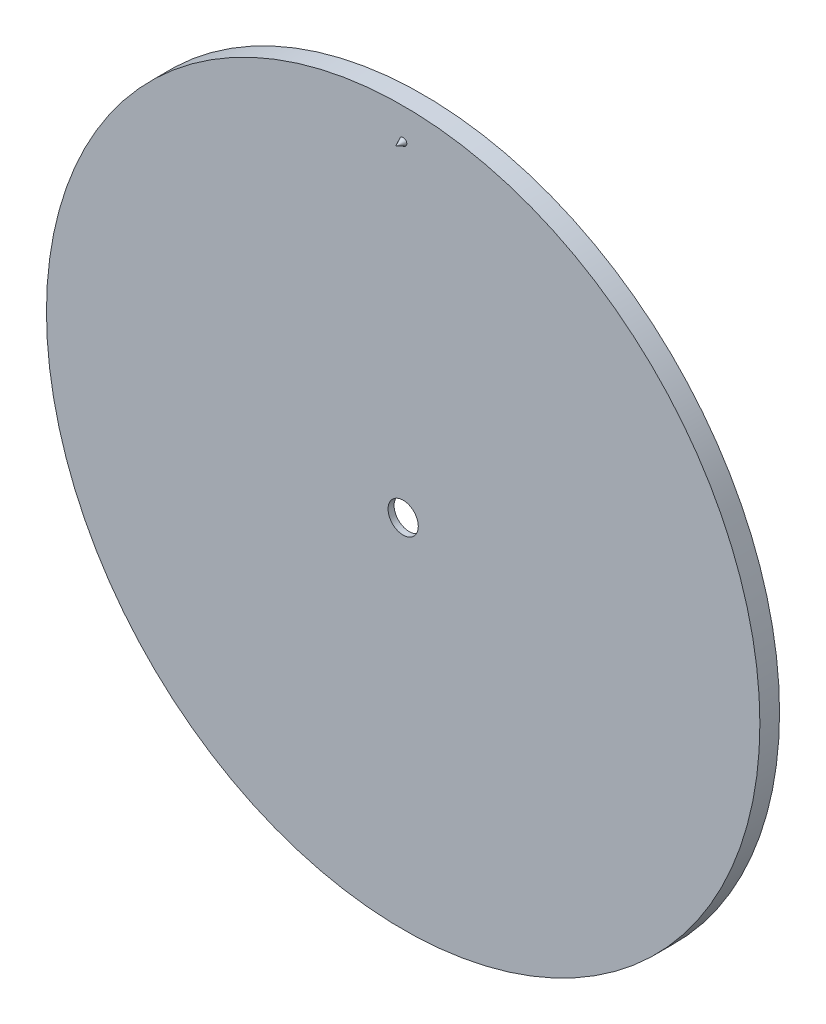
ISO-10303-21;
HEADER;
FILE_DESCRIPTION(('STEP AP214'),'2;1');
FILE_NAME('part.step','',(''),(''),'','','');
FILE_SCHEMA(('AUTOMOTIVE_DESIGN { 1 0 10303 214 1 1 1 1 }'));
ENDSEC;
DATA;
#1=APPLICATION_CONTEXT('core data for automotive mechanical design processes');
#2=APPLICATION_PROTOCOL_DEFINITION('international standard','automotive_design',2000,#1);
#3=PRODUCT_CONTEXT('',#1,'mechanical');
#4=PRODUCT('Part','Part','',(#3));
#5=PRODUCT_RELATED_PRODUCT_CATEGORY('part','',(#4));
#6=PRODUCT_DEFINITION_FORMATION('','',#4);
#7=PRODUCT_DEFINITION_CONTEXT('part definition',#1,'design');
#8=PRODUCT_DEFINITION('design','',#6,#7);
#9=PRODUCT_DEFINITION_SHAPE('','',#8);
#10=(LENGTH_UNIT() NAMED_UNIT(*) SI_UNIT(.MILLI.,.METRE.));
#11=(NAMED_UNIT(*) PLANE_ANGLE_UNIT() SI_UNIT($,.RADIAN.));
#12=(NAMED_UNIT(*) SI_UNIT($,.STERADIAN.) SOLID_ANGLE_UNIT());
#13=UNCERTAINTY_MEASURE_WITH_UNIT(LENGTH_MEASURE(1.E-05),#10,'distance_accuracy_value','');
#14=(GEOMETRIC_REPRESENTATION_CONTEXT(3) GLOBAL_UNCERTAINTY_ASSIGNED_CONTEXT((#13)) GLOBAL_UNIT_ASSIGNED_CONTEXT((#10,
#11,#12)) REPRESENTATION_CONTEXT('',''));
#15=CARTESIAN_POINT('',(0.,0.,0.));
#16=DIRECTION('',(0.,0.,1.));
#17=DIRECTION('',(1.,0.,0.));
#18=AXIS2_PLACEMENT_3D('',#15,#16,#17);
#19=CARTESIAN_POINT('',(0.,0.,4.1275));
#20=DIRECTION('',(0.,0.,-1.));
#21=DIRECTION('',(-1.,0.,0.));
#22=AXIS2_PLACEMENT_3D('',#19,#20,#21);
#23=CYLINDRICAL_SURFACE('',#22,3.175);
#24=CARTESIAN_POINT('',(0.,0.,4.1275));
#25=DIRECTION('',(0.,0.,1.));
#26=DIRECTION('',(1.,0.,0.));
#27=AXIS2_PLACEMENT_3D('',#24,#25,#26);
#28=CIRCLE('',#27,3.175);
#29=CARTESIAN_POINT('',(3.175,0.,4.1275));
#30=VERTEX_POINT('',#29);
#31=EDGE_CURVE('E66',#30,#30,#28,.T.);
#32=ORIENTED_EDGE('',*,*,#31,.T.);
#33=EDGE_LOOP('',(#32));
#34=FACE_BOUND('',#33,.T.);
#35=CARTESIAN_POINT('',(0.,0.,2.8575));
#36=DIRECTION('',(0.,0.,-1.));
#37=DIRECTION('',(-1.,0.,0.));
#38=AXIS2_PLACEMENT_3D('',#35,#36,#37);
#39=CIRCLE('',#38,3.175);
#40=CARTESIAN_POINT('',(-3.175,0.,2.8575));
#41=VERTEX_POINT('',#40);
#42=EDGE_CURVE('E41',#41,#41,#39,.T.);
#43=ORIENTED_EDGE('',*,*,#42,.T.);
#44=EDGE_LOOP('',(#43));
#45=FACE_BOUND('',#44,.T.);
#46=ADVANCED_FACE('F37',(#34,#45),#23,.F.);
#47=CARTESIAN_POINT('',(0.,0.,4.1275));
#48=DIRECTION('',(0.,0.,1.));
#49=DIRECTION('',(1.,0.,0.));
#50=AXIS2_PLACEMENT_3D('',#47,#48,#49);
#51=PLANE('',#50);
#52=CARTESIAN_POINT('',(0.,68.4003748190169,4.1275));
#53=DIRECTION('',(0.,0.,1.));
#54=DIRECTION('',(1.,0.,0.));
#55=AXIS2_PLACEMENT_3D('',#52,#53,#54);
#56=CIRCLE('',#55,0.761999999999999);
#57=CARTESIAN_POINT('',(0.761999999999999,68.4003748190169,4.1275));
#58=VERTEX_POINT('',#57);
#59=EDGE_CURVE('E56',#58,#58,#56,.T.);
#60=ORIENTED_EDGE('',*,*,#59,.F.);
#61=EDGE_LOOP('',(#60));
#62=FACE_BOUND('',#61,.T.);
#63=CARTESIAN_POINT('',(0.,0.,4.1275));
#64=DIRECTION('',(0.,0.,1.));
#65=DIRECTION('',(1.,0.,0.));
#66=AXIS2_PLACEMENT_3D('',#63,#64,#65);
#67=CIRCLE('',#66,74.93);
#68=CARTESIAN_POINT('',(74.93,0.,4.1275));
#69=VERTEX_POINT('',#68);
#70=EDGE_CURVE('E11',#69,#69,#67,.T.);
#71=ORIENTED_EDGE('',*,*,#70,.T.);
#72=EDGE_LOOP('',(#71));
#73=FACE_BOUND('',#72,.T.);
#74=ORIENTED_EDGE('',*,*,#31,.F.);
#75=EDGE_LOOP('',(#74));
#76=FACE_BOUND('',#75,.T.);
#77=ADVANCED_FACE('F74',(#62,#73,#76),#51,.T.);
#78=CARTESIAN_POINT('',(0.,0.,0.));
#79=DIRECTION('',(0.,0.,1.));
#80=DIRECTION('',(1.,0.,0.));
#81=AXIS2_PLACEMENT_3D('',#78,#79,#80);
#82=PLANE('',#81);
#83=CARTESIAN_POINT('',(0.,0.,0.));
#84=DIRECTION('',(0.,0.,-1.));
#85=DIRECTION('',(-1.,0.,0.));
#86=AXIS2_PLACEMENT_3D('',#83,#84,#85);
#87=CIRCLE('',#86,73.66);
#88=CARTESIAN_POINT('',(-73.66,0.,0.));
#89=VERTEX_POINT('',#88);
#90=EDGE_CURVE('E58',#89,#89,#87,.T.);
#91=ORIENTED_EDGE('',*,*,#90,.F.);
#92=EDGE_LOOP('',(#91));
#93=FACE_BOUND('',#92,.T.);
#94=CARTESIAN_POINT('',(0.,0.,0.));
#95=DIRECTION('',(0.,0.,1.));
#96=DIRECTION('',(1.,0.,0.));
#97=AXIS2_PLACEMENT_3D('',#94,#95,#96);
#98=CIRCLE('',#97,74.93);
#99=CARTESIAN_POINT('',(74.93,0.,0.));
#100=VERTEX_POINT('',#99);
#101=EDGE_CURVE('E45',#100,#100,#98,.T.);
#102=ORIENTED_EDGE('',*,*,#101,.F.);
#103=EDGE_LOOP('',(#102));
#104=FACE_BOUND('',#103,.T.);
#105=ADVANCED_FACE('F72',(#93,#104),#82,.F.);
#106=CARTESIAN_POINT('',(0.,0.,4.1275));
#107=DIRECTION('',(0.,0.,-1.));
#108=DIRECTION('',(-1.,0.,0.));
#109=AXIS2_PLACEMENT_3D('',#106,#107,#108);
#110=CYLINDRICAL_SURFACE('',#109,74.93);
#111=ORIENTED_EDGE('',*,*,#70,.F.);
#112=EDGE_LOOP('',(#111));
#113=FACE_BOUND('',#112,.T.);
#114=ORIENTED_EDGE('',*,*,#101,.T.);
#115=EDGE_LOOP('',(#114));
#116=FACE_BOUND('',#115,.T.);
#117=ADVANCED_FACE('F39',(#113,#116),#110,.T.);
#118=CARTESIAN_POINT('',(0.,0.,2.8575));
#119=DIRECTION('',(0.,0.,-1.));
#120=DIRECTION('',(-1.,0.,0.));
#121=AXIS2_PLACEMENT_3D('',#118,#119,#120);
#122=CYLINDRICAL_SURFACE('',#121,73.66);
#123=CARTESIAN_POINT('',(0.,0.,2.8575));
#124=DIRECTION('',(0.,0.,-1.));
#125=DIRECTION('',(-1.,0.,0.));
#126=AXIS2_PLACEMENT_3D('',#123,#124,#125);
#127=CIRCLE('',#126,73.66);
#128=CARTESIAN_POINT('',(-73.66,0.,2.8575));
#129=VERTEX_POINT('',#128);
#130=EDGE_CURVE('E61',#129,#129,#127,.T.);
#131=ORIENTED_EDGE('',*,*,#130,.F.);
#132=EDGE_LOOP('',(#131));
#133=FACE_BOUND('',#132,.T.);
#134=ORIENTED_EDGE('',*,*,#90,.T.);
#135=EDGE_LOOP('',(#134));
#136=FACE_BOUND('',#135,.T.);
#137=ADVANCED_FACE('F80',(#133,#136),#122,.F.);
#138=CARTESIAN_POINT('',(0.,0.,2.8575));
#139=DIRECTION('',(0.,0.,-1.));
#140=DIRECTION('',(-1.,0.,0.));
#141=AXIS2_PLACEMENT_3D('',#138,#139,#140);
#142=PLANE('',#141);
#143=ORIENTED_EDGE('',*,*,#42,.F.);
#144=EDGE_LOOP('',(#143));
#145=FACE_BOUND('',#144,.T.);
#146=ORIENTED_EDGE('',*,*,#130,.T.);
#147=EDGE_LOOP('',(#146));
#148=FACE_BOUND('',#147,.T.);
#149=ADVANCED_FACE('F52',(#145,#148),#142,.T.);
#150=CARTESIAN_POINT('',(0.,68.4003748190169,4.1275));
#151=DIRECTION('',(0.,0.,-1.));
#152=DIRECTION('',(-1.,0.,0.));
#153=AXIS2_PLACEMENT_3D('',#150,#151,#152);
#154=CONICAL_SURFACE('',#153,0.761999999999999,0.463647609000805);
#155=CARTESIAN_POINT('',(0.,68.4003748190169,5.6515));
#156=VERTEX_POINT('',#155);
#157=VERTEX_LOOP('',#156);
#158=FACE_BOUND('',#157,.T.);
#159=ORIENTED_EDGE('',*,*,#59,.T.);
#160=EDGE_LOOP('',(#159));
#161=FACE_BOUND('',#160,.T.);
#162=ADVANCED_FACE('F49',(#158,#161),#154,.T.);
#163=CLOSED_SHELL('',(#46,#77,#105,#117,#137,#149,#162));
#164=MANIFOLD_SOLID_BREP('B2',#163);
#165=ADVANCED_BREP_SHAPE_REPRESENTATION('',(#18,#164),#14);
#166=SHAPE_DEFINITION_REPRESENTATION(#9,#165);
ENDSEC;
END-ISO-10303-21;
